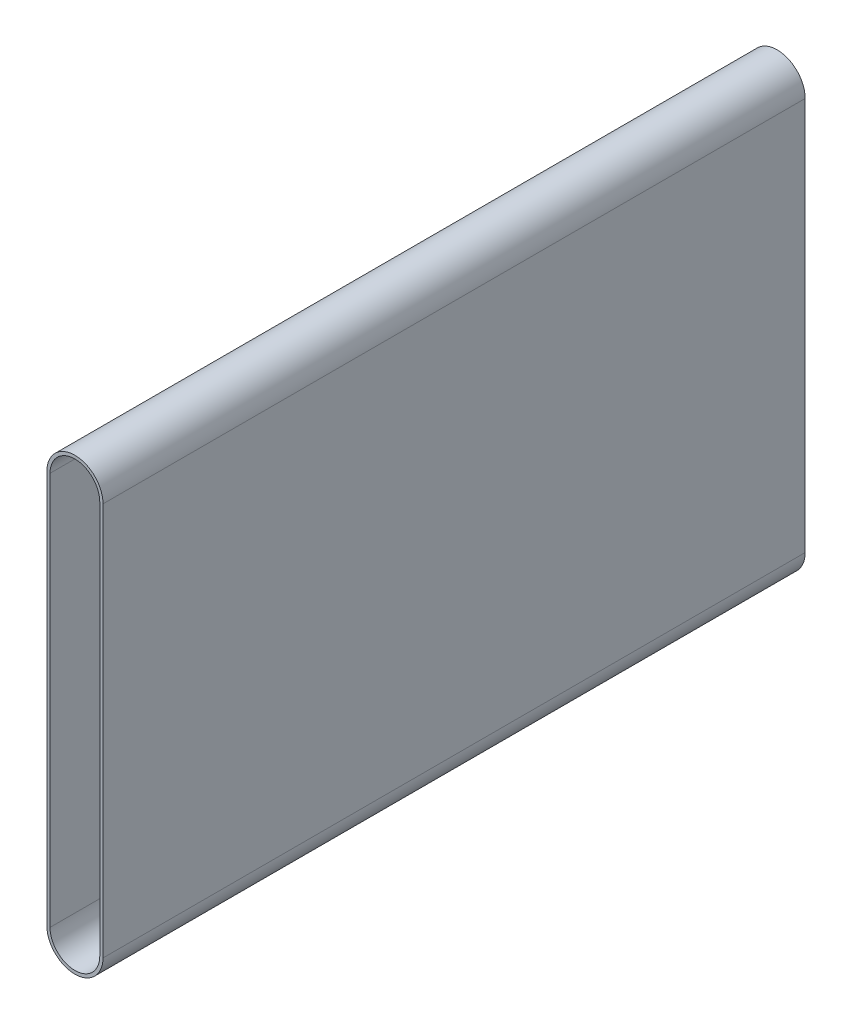
ISO-10303-21;
HEADER;
FILE_DESCRIPTION(('STEP AP214'),'2;1');
FILE_NAME('part.step','',(''),(''),'','','');
FILE_SCHEMA(('AUTOMOTIVE_DESIGN { 1 0 10303 214 1 1 1 1 }'));
ENDSEC;
DATA;
#1=APPLICATION_CONTEXT('core data for automotive mechanical design processes');
#2=APPLICATION_PROTOCOL_DEFINITION('international standard','automotive_design',2000,#1);
#3=PRODUCT_CONTEXT('',#1,'mechanical');
#4=PRODUCT('Part','Part','',(#3));
#5=PRODUCT_RELATED_PRODUCT_CATEGORY('part','',(#4));
#6=PRODUCT_DEFINITION_FORMATION('','',#4);
#7=PRODUCT_DEFINITION_CONTEXT('part definition',#1,'design');
#8=PRODUCT_DEFINITION('design','',#6,#7);
#9=PRODUCT_DEFINITION_SHAPE('','',#8);
#10=(LENGTH_UNIT() NAMED_UNIT(*) SI_UNIT(.MILLI.,.METRE.));
#11=(NAMED_UNIT(*) PLANE_ANGLE_UNIT() SI_UNIT($,.RADIAN.));
#12=(NAMED_UNIT(*) SI_UNIT($,.STERADIAN.) SOLID_ANGLE_UNIT());
#13=UNCERTAINTY_MEASURE_WITH_UNIT(LENGTH_MEASURE(1.E-05),#10,'distance_accuracy_value','');
#14=(GEOMETRIC_REPRESENTATION_CONTEXT(3) GLOBAL_UNCERTAINTY_ASSIGNED_CONTEXT((#13)) GLOBAL_UNIT_ASSIGNED_CONTEXT((#10,
#11,#12)) REPRESENTATION_CONTEXT('',''));
#15=CARTESIAN_POINT('',(0.,0.,0.));
#16=DIRECTION('',(0.,0.,1.));
#17=DIRECTION('',(1.,0.,0.));
#18=AXIS2_PLACEMENT_3D('',#15,#16,#17);
#19=CARTESIAN_POINT('',(0.,0.,250.));
#20=DIRECTION('',(0.,0.,-1.));
#21=DIRECTION('',(-1.,0.,0.));
#22=AXIS2_PLACEMENT_3D('',#19,#20,#21);
#23=CYLINDRICAL_SURFACE('',#22,10.);
#24=CARTESIAN_POINT('',(0.,0.,0.));
#25=DIRECTION('',(0.,0.,1.));
#26=DIRECTION('',(1.,0.,0.));
#27=AXIS2_PLACEMENT_3D('',#24,#25,#26);
#28=CIRCLE('',#27,10.);
#29=CARTESIAN_POINT('',(-10.,0.,0.));
#30=VERTEX_POINT('',#29);
#31=CARTESIAN_POINT('',(10.,0.,0.));
#32=VERTEX_POINT('',#31);
#33=EDGE_CURVE('E130',#30,#32,#28,.T.);
#34=ORIENTED_EDGE('',*,*,#33,.T.);
#35=DIRECTION('',(0.,0.,-1.));
#36=VECTOR('',#35,1.);
#37=CARTESIAN_POINT('',(10.,0.,250.));
#38=LINE('',#37,#36);
#39=CARTESIAN_POINT('',(10.,0.,250.));
#40=VERTEX_POINT('',#39);
#41=EDGE_CURVE('E11',#40,#32,#38,.T.);
#42=ORIENTED_EDGE('',*,*,#41,.F.);
#43=CARTESIAN_POINT('',(0.,0.,250.));
#44=DIRECTION('',(0.,0.,1.));
#45=DIRECTION('',(1.,0.,0.));
#46=AXIS2_PLACEMENT_3D('',#43,#44,#45);
#47=CIRCLE('',#46,10.);
#48=CARTESIAN_POINT('',(-10.,0.,250.));
#49=VERTEX_POINT('',#48);
#50=EDGE_CURVE('E134',#49,#40,#47,.T.);
#51=ORIENTED_EDGE('',*,*,#50,.F.);
#52=DIRECTION('',(0.,0.,-1.));
#53=VECTOR('',#52,1.);
#54=CARTESIAN_POINT('',(-10.,0.,250.));
#55=LINE('',#54,#53);
#56=EDGE_CURVE('E144',#49,#30,#55,.T.);
#57=ORIENTED_EDGE('',*,*,#56,.T.);
#58=EDGE_LOOP('',(#34,#42,#51,#57));
#59=FACE_BOUND('',#58,.T.);
#60=ADVANCED_FACE('F33',(#59),#23,.T.);
#61=CARTESIAN_POINT('',(10.,0.,250.));
#62=DIRECTION('',(-1.,0.,0.));
#63=DIRECTION('',(0.,0.,1.));
#64=AXIS2_PLACEMENT_3D('',#61,#62,#63);
#65=PLANE('',#64);
#66=DIRECTION('',(0.,1.,0.));
#67=VECTOR('',#66,1.);
#68=CARTESIAN_POINT('',(10.,0.,0.));
#69=LINE('',#68,#67);
#70=CARTESIAN_POINT('',(10.,140.,0.));
#71=VERTEX_POINT('',#70);
#72=EDGE_CURVE('E147',#32,#71,#69,.T.);
#73=ORIENTED_EDGE('',*,*,#72,.T.);
#74=DIRECTION('',(0.,0.,-1.));
#75=VECTOR('',#74,1.);
#76=CARTESIAN_POINT('',(10.,140.,250.));
#77=LINE('',#76,#75);
#78=CARTESIAN_POINT('',(10.,140.,250.));
#79=VERTEX_POINT('',#78);
#80=EDGE_CURVE('E40',#79,#71,#77,.T.);
#81=ORIENTED_EDGE('',*,*,#80,.F.);
#82=DIRECTION('',(0.,1.,0.));
#83=VECTOR('',#82,1.);
#84=CARTESIAN_POINT('',(10.,0.,250.));
#85=LINE('',#84,#83);
#86=EDGE_CURVE('E137',#40,#79,#85,.T.);
#87=ORIENTED_EDGE('',*,*,#86,.F.);
#88=ORIENTED_EDGE('',*,*,#41,.T.);
#89=EDGE_LOOP('',(#73,#81,#87,#88));
#90=FACE_BOUND('',#89,.T.);
#91=ADVANCED_FACE('F175',(#90),#65,.F.);
#92=CARTESIAN_POINT('',(0.,140.,250.));
#93=DIRECTION('',(0.,0.,-1.));
#94=DIRECTION('',(-1.,0.,0.));
#95=AXIS2_PLACEMENT_3D('',#92,#93,#94);
#96=CYLINDRICAL_SURFACE('',#95,10.);
#97=CARTESIAN_POINT('',(0.,140.,0.));
#98=DIRECTION('',(0.,0.,1.));
#99=DIRECTION('',(1.,0.,0.));
#100=AXIS2_PLACEMENT_3D('',#97,#98,#99);
#101=CIRCLE('',#100,10.);
#102=CARTESIAN_POINT('',(-10.,140.,0.));
#103=VERTEX_POINT('',#102);
#104=EDGE_CURVE('E149',#71,#103,#101,.T.);
#105=ORIENTED_EDGE('',*,*,#104,.T.);
#106=DIRECTION('',(0.,0.,-1.));
#107=VECTOR('',#106,1.);
#108=CARTESIAN_POINT('',(-10.,140.,250.));
#109=LINE('',#108,#107);
#110=CARTESIAN_POINT('',(-10.,140.,250.));
#111=VERTEX_POINT('',#110);
#112=EDGE_CURVE('E154',#111,#103,#109,.T.);
#113=ORIENTED_EDGE('',*,*,#112,.F.);
#114=CARTESIAN_POINT('',(0.,140.,250.));
#115=DIRECTION('',(0.,0.,1.));
#116=DIRECTION('',(1.,0.,0.));
#117=AXIS2_PLACEMENT_3D('',#114,#115,#116);
#118=CIRCLE('',#117,10.);
#119=EDGE_CURVE('E140',#79,#111,#118,.T.);
#120=ORIENTED_EDGE('',*,*,#119,.F.);
#121=ORIENTED_EDGE('',*,*,#80,.T.);
#122=EDGE_LOOP('',(#105,#113,#120,#121));
#123=FACE_BOUND('',#122,.T.);
#124=ADVANCED_FACE('F161',(#123),#96,.T.);
#125=CARTESIAN_POINT('',(-10.,0.,250.));
#126=DIRECTION('',(1.,0.,0.));
#127=DIRECTION('',(0.,0.,-1.));
#128=AXIS2_PLACEMENT_3D('',#125,#126,#127);
#129=PLANE('',#128);
#130=DIRECTION('',(0.,-1.,0.));
#131=VECTOR('',#130,1.);
#132=CARTESIAN_POINT('',(-10.,0.,0.));
#133=LINE('',#132,#131);
#134=EDGE_CURVE('E138',#103,#30,#133,.T.);
#135=ORIENTED_EDGE('',*,*,#134,.T.);
#136=ORIENTED_EDGE('',*,*,#56,.F.);
#137=DIRECTION('',(0.,-1.,0.));
#138=VECTOR('',#137,1.);
#139=CARTESIAN_POINT('',(-10.,0.,250.));
#140=LINE('',#139,#138);
#141=EDGE_CURVE('E142',#111,#49,#140,.T.);
#142=ORIENTED_EDGE('',*,*,#141,.F.);
#143=ORIENTED_EDGE('',*,*,#112,.T.);
#144=EDGE_LOOP('',(#135,#136,#142,#143));
#145=FACE_BOUND('',#144,.T.);
#146=ADVANCED_FACE('F168',(#145),#129,.F.);
#147=CARTESIAN_POINT('',(0.,0.,250.));
#148=DIRECTION('',(0.,0.,1.));
#149=DIRECTION('',(1.,0.,0.));
#150=AXIS2_PLACEMENT_3D('',#147,#148,#149);
#151=PLANE('',#150);
#152=CARTESIAN_POINT('',(0.,140.,250.));
#153=DIRECTION('',(0.,0.,1.));
#154=DIRECTION('',(1.,0.,0.));
#155=AXIS2_PLACEMENT_3D('',#152,#153,#154);
#156=CIRCLE('',#155,8.85686525830416);
#157=CARTESIAN_POINT('',(8.85686525830416,140.,250.));
#158=VERTEX_POINT('',#157);
#159=CARTESIAN_POINT('',(-8.85686525830416,140.,250.));
#160=VERTEX_POINT('',#159);
#161=EDGE_CURVE('E47',#158,#160,#156,.T.);
#162=ORIENTED_EDGE('',*,*,#161,.F.);
#163=DIRECTION('',(0.,1.,0.));
#164=VECTOR('',#163,1.);
#165=CARTESIAN_POINT('',(8.85686525830416,140.,250.));
#166=LINE('',#165,#164);
#167=CARTESIAN_POINT('',(8.85686525830416,0.,250.));
#168=VERTEX_POINT('',#167);
#169=EDGE_CURVE('E115',#168,#158,#166,.T.);
#170=ORIENTED_EDGE('',*,*,#169,.F.);
#171=CARTESIAN_POINT('',(0.,0.,250.));
#172=DIRECTION('',(0.,0.,1.));
#173=DIRECTION('',(1.,0.,0.));
#174=AXIS2_PLACEMENT_3D('',#171,#172,#173);
#175=CIRCLE('',#174,8.85686525830416);
#176=CARTESIAN_POINT('',(-8.85686525830416,0.,250.));
#177=VERTEX_POINT('',#176);
#178=EDGE_CURVE('E118',#177,#168,#175,.T.);
#179=ORIENTED_EDGE('',*,*,#178,.F.);
#180=DIRECTION('',(0.,-1.,0.));
#181=VECTOR('',#180,1.);
#182=CARTESIAN_POINT('',(-8.85686525830416,140.,250.));
#183=LINE('',#182,#181);
#184=EDGE_CURVE('E124',#160,#177,#183,.T.);
#185=ORIENTED_EDGE('',*,*,#184,.F.);
#186=EDGE_LOOP('',(#162,#170,#179,#185));
#187=FACE_BOUND('',#186,.T.);
#188=ORIENTED_EDGE('',*,*,#50,.T.);
#189=ORIENTED_EDGE('',*,*,#86,.T.);
#190=ORIENTED_EDGE('',*,*,#119,.T.);
#191=ORIENTED_EDGE('',*,*,#141,.T.);
#192=EDGE_LOOP('',(#188,#189,#190,#191));
#193=FACE_BOUND('',#192,.T.);
#194=ADVANCED_FACE('F174',(#187,#193),#151,.T.);
#195=CARTESIAN_POINT('',(0.,0.,0.));
#196=DIRECTION('',(0.,0.,1.));
#197=DIRECTION('',(1.,0.,0.));
#198=AXIS2_PLACEMENT_3D('',#195,#196,#197);
#199=PLANE('',#198);
#200=DIRECTION('',(0.,1.,0.));
#201=VECTOR('',#200,1.);
#202=CARTESIAN_POINT('',(8.85686525830416,140.,0.));
#203=LINE('',#202,#201);
#204=CARTESIAN_POINT('',(8.85686525830416,0.,0.));
#205=VERTEX_POINT('',#204);
#206=CARTESIAN_POINT('',(8.85686525830416,140.,0.));
#207=VERTEX_POINT('',#206);
#208=EDGE_CURVE('E105',#205,#207,#203,.T.);
#209=ORIENTED_EDGE('',*,*,#208,.T.);
#210=CARTESIAN_POINT('',(0.,140.,0.));
#211=DIRECTION('',(0.,0.,1.));
#212=DIRECTION('',(1.,0.,0.));
#213=AXIS2_PLACEMENT_3D('',#210,#211,#212);
#214=CIRCLE('',#213,8.85686525830416);
#215=CARTESIAN_POINT('',(-8.85686525830416,140.,0.));
#216=VERTEX_POINT('',#215);
#217=EDGE_CURVE('E99',#207,#216,#214,.T.);
#218=ORIENTED_EDGE('',*,*,#217,.T.);
#219=DIRECTION('',(0.,-1.,0.));
#220=VECTOR('',#219,1.);
#221=CARTESIAN_POINT('',(-8.85686525830416,140.,0.));
#222=LINE('',#221,#220);
#223=CARTESIAN_POINT('',(-8.85686525830416,0.,0.));
#224=VERTEX_POINT('',#223);
#225=EDGE_CURVE('E108',#216,#224,#222,.T.);
#226=ORIENTED_EDGE('',*,*,#225,.T.);
#227=CARTESIAN_POINT('',(0.,0.,0.));
#228=DIRECTION('',(0.,0.,1.));
#229=DIRECTION('',(1.,0.,0.));
#230=AXIS2_PLACEMENT_3D('',#227,#228,#229);
#231=CIRCLE('',#230,8.85686525830416);
#232=EDGE_CURVE('E55',#224,#205,#231,.T.);
#233=ORIENTED_EDGE('',*,*,#232,.T.);
#234=EDGE_LOOP('',(#209,#218,#226,#233));
#235=FACE_BOUND('',#234,.T.);
#236=ORIENTED_EDGE('',*,*,#33,.F.);
#237=ORIENTED_EDGE('',*,*,#134,.F.);
#238=ORIENTED_EDGE('',*,*,#104,.F.);
#239=ORIENTED_EDGE('',*,*,#72,.F.);
#240=EDGE_LOOP('',(#236,#237,#238,#239));
#241=FACE_BOUND('',#240,.T.);
#242=ADVANCED_FACE('F112',(#235,#241),#199,.F.);
#243=CARTESIAN_POINT('',(0.,140.,0.));
#244=DIRECTION('',(0.,0.,1.));
#245=DIRECTION('',(1.,0.,0.));
#246=AXIS2_PLACEMENT_3D('',#243,#244,#245);
#247=CYLINDRICAL_SURFACE('',#246,8.85686525830416);
#248=ORIENTED_EDGE('',*,*,#161,.T.);
#249=DIRECTION('',(0.,0.,1.));
#250=VECTOR('',#249,1.);
#251=CARTESIAN_POINT('',(-8.85686525830416,140.,0.));
#252=LINE('',#251,#250);
#253=EDGE_CURVE('E95',#216,#160,#252,.T.);
#254=ORIENTED_EDGE('',*,*,#253,.F.);
#255=ORIENTED_EDGE('',*,*,#217,.F.);
#256=DIRECTION('',(0.,0.,1.));
#257=VECTOR('',#256,1.);
#258=CARTESIAN_POINT('',(8.85686525830416,140.,0.));
#259=LINE('',#258,#257);
#260=EDGE_CURVE('E128',#207,#158,#259,.T.);
#261=ORIENTED_EDGE('',*,*,#260,.T.);
#262=EDGE_LOOP('',(#248,#254,#255,#261));
#263=FACE_BOUND('',#262,.T.);
#264=ADVANCED_FACE('F97',(#263),#247,.F.);
#265=CARTESIAN_POINT('',(8.85686525830416,140.,0.));
#266=DIRECTION('',(1.,0.,0.));
#267=DIRECTION('',(0.,0.,-1.));
#268=AXIS2_PLACEMENT_3D('',#265,#266,#267);
#269=PLANE('',#268);
#270=ORIENTED_EDGE('',*,*,#169,.T.);
#271=ORIENTED_EDGE('',*,*,#260,.F.);
#272=ORIENTED_EDGE('',*,*,#208,.F.);
#273=DIRECTION('',(0.,0.,1.));
#274=VECTOR('',#273,1.);
#275=CARTESIAN_POINT('',(8.85686525830416,0.,0.));
#276=LINE('',#275,#274);
#277=EDGE_CURVE('E131',#205,#168,#276,.T.);
#278=ORIENTED_EDGE('',*,*,#277,.T.);
#279=EDGE_LOOP('',(#270,#271,#272,#278));
#280=FACE_BOUND('',#279,.T.);
#281=ADVANCED_FACE('F192',(#280),#269,.F.);
#282=CARTESIAN_POINT('',(0.,0.,0.));
#283=DIRECTION('',(0.,0.,1.));
#284=DIRECTION('',(1.,0.,0.));
#285=AXIS2_PLACEMENT_3D('',#282,#283,#284);
#286=CYLINDRICAL_SURFACE('',#285,8.85686525830416);
#287=ORIENTED_EDGE('',*,*,#178,.T.);
#288=ORIENTED_EDGE('',*,*,#277,.F.);
#289=ORIENTED_EDGE('',*,*,#232,.F.);
#290=DIRECTION('',(0.,0.,1.));
#291=VECTOR('',#290,1.);
#292=CARTESIAN_POINT('',(-8.85686525830416,0.,0.));
#293=LINE('',#292,#291);
#294=EDGE_CURVE('E104',#224,#177,#293,.T.);
#295=ORIENTED_EDGE('',*,*,#294,.T.);
#296=EDGE_LOOP('',(#287,#288,#289,#295));
#297=FACE_BOUND('',#296,.T.);
#298=ADVANCED_FACE('F195',(#297),#286,.F.);
#299=CARTESIAN_POINT('',(-8.85686525830416,140.,0.));
#300=DIRECTION('',(-1.,0.,0.));
#301=DIRECTION('',(0.,0.,1.));
#302=AXIS2_PLACEMENT_3D('',#299,#300,#301);
#303=PLANE('',#302);
#304=ORIENTED_EDGE('',*,*,#184,.T.);
#305=ORIENTED_EDGE('',*,*,#294,.F.);
#306=ORIENTED_EDGE('',*,*,#225,.F.);
#307=ORIENTED_EDGE('',*,*,#253,.T.);
#308=EDGE_LOOP('',(#304,#305,#306,#307));
#309=FACE_BOUND('',#308,.T.);
#310=ADVANCED_FACE('F109',(#309),#303,.F.);
#311=CLOSED_SHELL('',(#60,#91,#124,#146,#194,#242,#264,#281,#298,#310));
#312=MANIFOLD_SOLID_BREP('B2',#311);
#313=ADVANCED_BREP_SHAPE_REPRESENTATION('',(#18,#312),#14);
#314=SHAPE_DEFINITION_REPRESENTATION(#9,#313);
ENDSEC;
END-ISO-10303-21;
